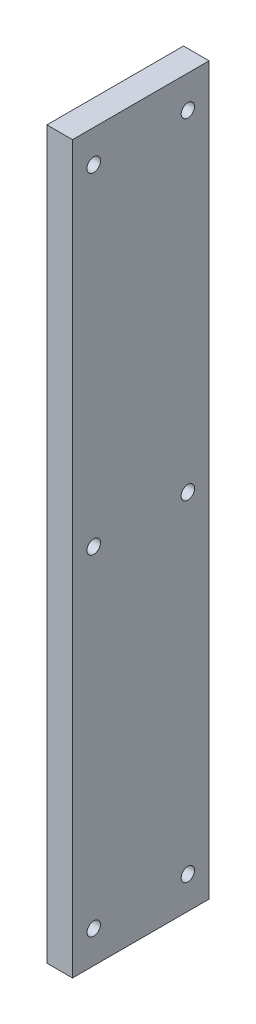
ISO-10303-21;
HEADER;
FILE_DESCRIPTION(('STEP AP214'),'2;1');
FILE_NAME('part.step','',(''),(''),'','','');
FILE_SCHEMA(('AUTOMOTIVE_DESIGN { 1 0 10303 214 1 1 1 1 }'));
ENDSEC;
DATA;
#1=APPLICATION_CONTEXT('core data for automotive mechanical design processes');
#2=APPLICATION_PROTOCOL_DEFINITION('international standard','automotive_design',2000,#1);
#3=PRODUCT_CONTEXT('',#1,'mechanical');
#4=PRODUCT('Part','Part','',(#3));
#5=PRODUCT_RELATED_PRODUCT_CATEGORY('part','',(#4));
#6=PRODUCT_DEFINITION_FORMATION('','',#4);
#7=PRODUCT_DEFINITION_CONTEXT('part definition',#1,'design');
#8=PRODUCT_DEFINITION('design','',#6,#7);
#9=PRODUCT_DEFINITION_SHAPE('','',#8);
#10=(LENGTH_UNIT() NAMED_UNIT(*) SI_UNIT(.MILLI.,.METRE.));
#11=(NAMED_UNIT(*) PLANE_ANGLE_UNIT() SI_UNIT($,.RADIAN.));
#12=(NAMED_UNIT(*) SI_UNIT($,.STERADIAN.) SOLID_ANGLE_UNIT());
#13=UNCERTAINTY_MEASURE_WITH_UNIT(LENGTH_MEASURE(1.E-05),#10,'distance_accuracy_value','');
#14=(GEOMETRIC_REPRESENTATION_CONTEXT(3) GLOBAL_UNCERTAINTY_ASSIGNED_CONTEXT((#13)) GLOBAL_UNIT_ASSIGNED_CONTEXT((#10,
#11,#12)) REPRESENTATION_CONTEXT('',''));
#15=CARTESIAN_POINT('',(0.,0.,0.));
#16=DIRECTION('',(0.,0.,1.));
#17=DIRECTION('',(1.,0.,0.));
#18=AXIS2_PLACEMENT_3D('',#15,#16,#17);
#19=CARTESIAN_POINT('',(9.525,-135.,25.4));
#20=DIRECTION('',(0.,0.,-1.));
#21=DIRECTION('',(0.,1.,0.));
#22=AXIS2_PLACEMENT_3D('',#19,#20,#21);
#23=PLANE('',#22);
#24=DIRECTION('',(0.,-1.,0.));
#25=VECTOR('',#24,1.);
#26=CARTESIAN_POINT('',(0.,-135.,25.4));
#27=LINE('',#26,#25);
#28=CARTESIAN_POINT('',(0.,135.,25.4));
#29=VERTEX_POINT('',#28);
#30=CARTESIAN_POINT('',(0.,-135.,25.4));
#31=VERTEX_POINT('',#30);
#32=EDGE_CURVE('E96',#29,#31,#27,.T.);
#33=ORIENTED_EDGE('',*,*,#32,.T.);
#34=DIRECTION('',(-1.,0.,0.));
#35=VECTOR('',#34,1.);
#36=CARTESIAN_POINT('',(9.525,-135.,25.4));
#37=LINE('',#36,#35);
#38=CARTESIAN_POINT('',(9.525,-135.,25.4));
#39=VERTEX_POINT('',#38);
#40=EDGE_CURVE('E11',#39,#31,#37,.T.);
#41=ORIENTED_EDGE('',*,*,#40,.F.);
#42=DIRECTION('',(0.,-1.,0.));
#43=VECTOR('',#42,1.);
#44=CARTESIAN_POINT('',(9.525,-135.,25.4));
#45=LINE('',#44,#43);
#46=CARTESIAN_POINT('',(9.525,135.,25.4));
#47=VERTEX_POINT('',#46);
#48=EDGE_CURVE('E84',#47,#39,#45,.T.);
#49=ORIENTED_EDGE('',*,*,#48,.F.);
#50=DIRECTION('',(-1.,0.,0.));
#51=VECTOR('',#50,1.);
#52=CARTESIAN_POINT('',(9.525,135.,25.4));
#53=LINE('',#52,#51);
#54=EDGE_CURVE('E92',#47,#29,#53,.T.);
#55=ORIENTED_EDGE('',*,*,#54,.T.);
#56=EDGE_LOOP('',(#33,#41,#49,#55));
#57=FACE_BOUND('',#56,.T.);
#58=ADVANCED_FACE('F33',(#57),#23,.F.);
#59=CARTESIAN_POINT('',(9.525,-135.,-25.4));
#60=DIRECTION('',(0.,1.,0.));
#61=DIRECTION('',(0.,0.,1.));
#62=AXIS2_PLACEMENT_3D('',#59,#60,#61);
#63=PLANE('',#62);
#64=DIRECTION('',(0.,0.,-1.));
#65=VECTOR('',#64,1.);
#66=CARTESIAN_POINT('',(0.,-135.,-25.4));
#67=LINE('',#66,#65);
#68=CARTESIAN_POINT('',(0.,-135.,-25.4));
#69=VERTEX_POINT('',#68);
#70=EDGE_CURVE('E88',#31,#69,#67,.T.);
#71=ORIENTED_EDGE('',*,*,#70,.T.);
#72=DIRECTION('',(-1.,0.,0.));
#73=VECTOR('',#72,1.);
#74=CARTESIAN_POINT('',(9.525,-135.,-25.4));
#75=LINE('',#74,#73);
#76=CARTESIAN_POINT('',(9.525,-135.,-25.4));
#77=VERTEX_POINT('',#76);
#78=EDGE_CURVE('E41',#77,#69,#75,.T.);
#79=ORIENTED_EDGE('',*,*,#78,.F.);
#80=DIRECTION('',(0.,0.,-1.));
#81=VECTOR('',#80,1.);
#82=CARTESIAN_POINT('',(9.525,-135.,-25.4));
#83=LINE('',#82,#81);
#84=EDGE_CURVE('E79',#39,#77,#83,.T.);
#85=ORIENTED_EDGE('',*,*,#84,.F.);
#86=ORIENTED_EDGE('',*,*,#40,.T.);
#87=EDGE_LOOP('',(#71,#79,#85,#86));
#88=FACE_BOUND('',#87,.T.);
#89=ADVANCED_FACE('F87',(#88),#63,.F.);
#90=CARTESIAN_POINT('',(9.525,-135.,-25.4));
#91=DIRECTION('',(0.,0.,1.));
#92=DIRECTION('',(1.,0.,0.));
#93=AXIS2_PLACEMENT_3D('',#90,#91,#92);
#94=PLANE('',#93);
#95=DIRECTION('',(0.,1.,0.));
#96=VECTOR('',#95,1.);
#97=CARTESIAN_POINT('',(0.,-135.,-25.4));
#98=LINE('',#97,#96);
#99=CARTESIAN_POINT('',(0.,135.,-25.4));
#100=VERTEX_POINT('',#99);
#101=EDGE_CURVE('E66',#69,#100,#98,.T.);
#102=ORIENTED_EDGE('',*,*,#101,.T.);
#103=DIRECTION('',(-1.,0.,0.));
#104=VECTOR('',#103,1.);
#105=CARTESIAN_POINT('',(9.525,135.,-25.4));
#106=LINE('',#105,#104);
#107=CARTESIAN_POINT('',(9.525,135.,-25.4));
#108=VERTEX_POINT('',#107);
#109=EDGE_CURVE('E89',#108,#100,#106,.T.);
#110=ORIENTED_EDGE('',*,*,#109,.F.);
#111=DIRECTION('',(0.,1.,0.));
#112=VECTOR('',#111,1.);
#113=CARTESIAN_POINT('',(9.525,-135.,-25.4));
#114=LINE('',#113,#112);
#115=EDGE_CURVE('E82',#77,#108,#114,.T.);
#116=ORIENTED_EDGE('',*,*,#115,.F.);
#117=ORIENTED_EDGE('',*,*,#78,.T.);
#118=EDGE_LOOP('',(#102,#110,#116,#117));
#119=FACE_BOUND('',#118,.T.);
#120=ADVANCED_FACE('F90',(#119),#94,.F.);
#121=CARTESIAN_POINT('',(9.525,135.,-25.4));
#122=DIRECTION('',(0.,-1.,0.));
#123=DIRECTION('',(0.,0.,-1.));
#124=AXIS2_PLACEMENT_3D('',#121,#122,#123);
#125=PLANE('',#124);
#126=DIRECTION('',(0.,0.,1.));
#127=VECTOR('',#126,1.);
#128=CARTESIAN_POINT('',(0.,135.,-25.4));
#129=LINE('',#128,#127);
#130=EDGE_CURVE('E72',#100,#29,#129,.T.);
#131=ORIENTED_EDGE('',*,*,#130,.T.);
#132=ORIENTED_EDGE('',*,*,#54,.F.);
#133=DIRECTION('',(0.,0.,1.));
#134=VECTOR('',#133,1.);
#135=CARTESIAN_POINT('',(9.525,135.,-25.4));
#136=LINE('',#135,#134);
#137=EDGE_CURVE('E49',#108,#47,#136,.T.);
#138=ORIENTED_EDGE('',*,*,#137,.F.);
#139=ORIENTED_EDGE('',*,*,#109,.T.);
#140=EDGE_LOOP('',(#131,#132,#138,#139));
#141=FACE_BOUND('',#140,.T.);
#142=ADVANCED_FACE('F104',(#141),#125,.F.);
#143=CARTESIAN_POINT('',(9.525,0.,0.));
#144=DIRECTION('',(1.,0.,0.));
#145=DIRECTION('',(0.,0.,-1.));
#146=AXIS2_PLACEMENT_3D('',#143,#144,#145);
#147=PLANE('',#146);
#148=CARTESIAN_POINT('',(9.525,0.,-17.5));
#149=DIRECTION('',(1.,0.,0.));
#150=DIRECTION('',(0.,0.,-1.));
#151=AXIS2_PLACEMENT_3D('',#148,#149,#150);
#152=CIRCLE('',#151,2.50801824007187);
#153=CARTESIAN_POINT('',(9.525,0.,-20.0080182400719));
#154=VERTEX_POINT('',#153);
#155=EDGE_CURVE('E128',#154,#154,#152,.T.);
#156=ORIENTED_EDGE('',*,*,#155,.F.);
#157=EDGE_LOOP('',(#156));
#158=FACE_BOUND('',#157,.T.);
#159=CARTESIAN_POINT('',(9.525,0.,17.5));
#160=DIRECTION('',(1.,0.,0.));
#161=DIRECTION('',(0.,0.,-1.));
#162=AXIS2_PLACEMENT_3D('',#159,#160,#161);
#163=CIRCLE('',#162,2.51510559759041);
#164=CARTESIAN_POINT('',(9.525,0.,14.9848944024096));
#165=VERTEX_POINT('',#164);
#166=EDGE_CURVE('E134',#165,#165,#163,.T.);
#167=ORIENTED_EDGE('',*,*,#166,.F.);
#168=EDGE_LOOP('',(#167));
#169=FACE_BOUND('',#168,.T.);
#170=CARTESIAN_POINT('',(9.525,123.,17.5));
#171=DIRECTION('',(1.,0.,0.));
#172=DIRECTION('',(0.,0.,-1.));
#173=AXIS2_PLACEMENT_3D('',#170,#171,#172);
#174=CIRCLE('',#173,2.53355567132593);
#175=CARTESIAN_POINT('',(9.525,123.,14.9664443286741));
#176=VERTEX_POINT('',#175);
#177=EDGE_CURVE('E140',#176,#176,#174,.T.);
#178=ORIENTED_EDGE('',*,*,#177,.F.);
#179=EDGE_LOOP('',(#178));
#180=FACE_BOUND('',#179,.T.);
#181=CARTESIAN_POINT('',(9.525,123.,-17.5));
#182=DIRECTION('',(1.,0.,0.));
#183=DIRECTION('',(0.,0.,-1.));
#184=AXIS2_PLACEMENT_3D('',#181,#182,#183);
#185=CIRCLE('',#184,2.48081684329031);
#186=CARTESIAN_POINT('',(9.525,123.,-19.9808168432903));
#187=VERTEX_POINT('',#186);
#188=EDGE_CURVE('E116',#187,#187,#185,.T.);
#189=ORIENTED_EDGE('',*,*,#188,.F.);
#190=EDGE_LOOP('',(#189));
#191=FACE_BOUND('',#190,.T.);
#192=CARTESIAN_POINT('',(9.525,-123.,-17.5));
#193=DIRECTION('',(1.,0.,0.));
#194=DIRECTION('',(0.,0.,-1.));
#195=AXIS2_PLACEMENT_3D('',#192,#193,#194);
#196=CIRCLE('',#195,2.48624336836679);
#197=CARTESIAN_POINT('',(9.525,-123.,-19.9862433683668));
#198=VERTEX_POINT('',#197);
#199=EDGE_CURVE('E123',#198,#198,#196,.T.);
#200=ORIENTED_EDGE('',*,*,#199,.F.);
#201=EDGE_LOOP('',(#200));
#202=FACE_BOUND('',#201,.T.);
#203=CARTESIAN_POINT('',(9.525,-123.,17.5));
#204=DIRECTION('',(1.,0.,0.));
#205=DIRECTION('',(0.,0.,-1.));
#206=AXIS2_PLACEMENT_3D('',#203,#204,#205);
#207=CIRCLE('',#206,2.48487197635141);
#208=CARTESIAN_POINT('',(9.525,-123.,15.0151280236486));
#209=VERTEX_POINT('',#208);
#210=EDGE_CURVE('E110',#209,#209,#207,.T.);
#211=ORIENTED_EDGE('',*,*,#210,.F.);
#212=EDGE_LOOP('',(#211));
#213=FACE_BOUND('',#212,.T.);
#214=ORIENTED_EDGE('',*,*,#48,.T.);
#215=ORIENTED_EDGE('',*,*,#84,.T.);
#216=ORIENTED_EDGE('',*,*,#115,.T.);
#217=ORIENTED_EDGE('',*,*,#137,.T.);
#218=EDGE_LOOP('',(#214,#215,#216,#217));
#219=FACE_BOUND('',#218,.T.);
#220=ADVANCED_FACE('F80',(#158,#169,#180,#191,#202,#213,#219),#147,.T.);
#221=CARTESIAN_POINT('',(0.,0.,0.));
#222=DIRECTION('',(1.,0.,0.));
#223=DIRECTION('',(0.,0.,-1.));
#224=AXIS2_PLACEMENT_3D('',#221,#222,#223);
#225=PLANE('',#224);
#226=CARTESIAN_POINT('',(0.,0.,-17.5));
#227=DIRECTION('',(1.,0.,0.));
#228=DIRECTION('',(0.,0.,-1.));
#229=AXIS2_PLACEMENT_3D('',#226,#227,#228);
#230=CIRCLE('',#229,2.50801824007187);
#231=CARTESIAN_POINT('',(0.,0.,-20.0080182400719));
#232=VERTEX_POINT('',#231);
#233=EDGE_CURVE('E131',#232,#232,#230,.T.);
#234=ORIENTED_EDGE('',*,*,#233,.T.);
#235=EDGE_LOOP('',(#234));
#236=FACE_BOUND('',#235,.T.);
#237=CARTESIAN_POINT('',(0.,0.,17.5));
#238=DIRECTION('',(1.,0.,0.));
#239=DIRECTION('',(0.,0.,-1.));
#240=AXIS2_PLACEMENT_3D('',#237,#238,#239);
#241=CIRCLE('',#240,2.51510559759041);
#242=CARTESIAN_POINT('',(0.,0.,14.9848944024096));
#243=VERTEX_POINT('',#242);
#244=EDGE_CURVE('E137',#243,#243,#241,.T.);
#245=ORIENTED_EDGE('',*,*,#244,.T.);
#246=EDGE_LOOP('',(#245));
#247=FACE_BOUND('',#246,.T.);
#248=CARTESIAN_POINT('',(0.,123.,17.5));
#249=DIRECTION('',(1.,0.,0.));
#250=DIRECTION('',(0.,0.,-1.));
#251=AXIS2_PLACEMENT_3D('',#248,#249,#250);
#252=CIRCLE('',#251,2.53355567132593);
#253=CARTESIAN_POINT('',(0.,123.,14.9664443286741));
#254=VERTEX_POINT('',#253);
#255=EDGE_CURVE('E120',#254,#254,#252,.T.);
#256=ORIENTED_EDGE('',*,*,#255,.T.);
#257=EDGE_LOOP('',(#256));
#258=FACE_BOUND('',#257,.T.);
#259=CARTESIAN_POINT('',(0.,123.,-17.5));
#260=DIRECTION('',(1.,0.,0.));
#261=DIRECTION('',(0.,0.,-1.));
#262=AXIS2_PLACEMENT_3D('',#259,#260,#261);
#263=CIRCLE('',#262,2.48081684329031);
#264=CARTESIAN_POINT('',(0.,123.,-19.9808168432903));
#265=VERTEX_POINT('',#264);
#266=EDGE_CURVE('E119',#265,#265,#263,.T.);
#267=ORIENTED_EDGE('',*,*,#266,.T.);
#268=EDGE_LOOP('',(#267));
#269=FACE_BOUND('',#268,.T.);
#270=CARTESIAN_POINT('',(0.,-123.,-17.5));
#271=DIRECTION('',(1.,0.,0.));
#272=DIRECTION('',(0.,0.,-1.));
#273=AXIS2_PLACEMENT_3D('',#270,#271,#272);
#274=CIRCLE('',#273,2.48624336836679);
#275=CARTESIAN_POINT('',(0.,-123.,-19.9862433683668));
#276=VERTEX_POINT('',#275);
#277=EDGE_CURVE('E113',#276,#276,#274,.T.);
#278=ORIENTED_EDGE('',*,*,#277,.T.);
#279=EDGE_LOOP('',(#278));
#280=FACE_BOUND('',#279,.T.);
#281=CARTESIAN_POINT('',(0.,-123.,17.5));
#282=DIRECTION('',(1.,0.,0.));
#283=DIRECTION('',(0.,0.,-1.));
#284=AXIS2_PLACEMENT_3D('',#281,#282,#283);
#285=CIRCLE('',#284,2.48487197635141);
#286=CARTESIAN_POINT('',(0.,-123.,15.0151280236486));
#287=VERTEX_POINT('',#286);
#288=EDGE_CURVE('E99',#287,#287,#285,.T.);
#289=ORIENTED_EDGE('',*,*,#288,.T.);
#290=EDGE_LOOP('',(#289));
#291=FACE_BOUND('',#290,.T.);
#292=ORIENTED_EDGE('',*,*,#32,.F.);
#293=ORIENTED_EDGE('',*,*,#130,.F.);
#294=ORIENTED_EDGE('',*,*,#101,.F.);
#295=ORIENTED_EDGE('',*,*,#70,.F.);
#296=EDGE_LOOP('',(#292,#293,#294,#295));
#297=FACE_BOUND('',#296,.T.);
#298=ADVANCED_FACE('F107',(#236,#247,#258,#269,#280,#291,#297),#225,.F.);
#299=CARTESIAN_POINT('',(0.,-123.,17.5));
#300=DIRECTION('',(1.,0.,0.));
#301=DIRECTION('',(0.,0.,-1.));
#302=AXIS2_PLACEMENT_3D('',#299,#300,#301);
#303=CYLINDRICAL_SURFACE('',#302,2.48487197635141);
#304=CARTESIAN_POINT('',(0.,-123.,15.0151280236486));
#305=CARTESIAN_POINT('',(0.0992187499999999,-123.,15.0151280236486));
#306=CARTESIAN_POINT('',(0.1984375,-123.,15.0151280236486));
#307=CARTESIAN_POINT('',(0.396875,-123.,15.0151280236486));
#308=CARTESIAN_POINT('',(0.49609375,-123.,15.0151280236486));
#309=CARTESIAN_POINT('',(0.69453125,-123.,15.0151280236486));
#310=CARTESIAN_POINT('',(0.79375,-123.,15.0151280236486));
#311=CARTESIAN_POINT('',(0.9921875,-123.,15.0151280236486));
#312=CARTESIAN_POINT('',(1.09140625,-123.,15.0151280236486));
#313=CARTESIAN_POINT('',(1.28984375,-123.,15.0151280236486));
#314=CARTESIAN_POINT('',(1.3890625,-123.,15.0151280236486));
#315=CARTESIAN_POINT('',(1.5875,-123.,15.0151280236486));
#316=CARTESIAN_POINT('',(1.68671875,-123.,15.0151280236486));
#317=CARTESIAN_POINT('',(1.88515625,-123.,15.0151280236486));
#318=CARTESIAN_POINT('',(1.984375,-123.,15.0151280236486));
#319=CARTESIAN_POINT('',(2.1828125,-123.,15.0151280236486));
#320=CARTESIAN_POINT('',(2.28203125,-123.,15.0151280236486));
#321=CARTESIAN_POINT('',(2.48046875,-123.,15.0151280236486));
#322=CARTESIAN_POINT('',(2.5796875,-123.,15.0151280236486));
#323=CARTESIAN_POINT('',(2.778125,-123.,15.0151280236486));
#324=CARTESIAN_POINT('',(2.87734375,-123.,15.0151280236486));
#325=CARTESIAN_POINT('',(3.07578125,-123.,15.0151280236486));
#326=CARTESIAN_POINT('',(3.175,-123.,15.0151280236486));
#327=CARTESIAN_POINT('',(3.3734375,-123.,15.0151280236486));
#328=CARTESIAN_POINT('',(3.47265625,-123.,15.0151280236486));
#329=CARTESIAN_POINT('',(3.67109375,-123.,15.0151280236486));
#330=CARTESIAN_POINT('',(3.7703125,-123.,15.0151280236486));
#331=CARTESIAN_POINT('',(3.96875,-123.,15.0151280236486));
#332=CARTESIAN_POINT('',(4.06796875,-123.,15.0151280236486));
#333=CARTESIAN_POINT('',(4.26640625,-123.,15.0151280236486));
#334=CARTESIAN_POINT('',(4.365625,-123.,15.0151280236486));
#335=CARTESIAN_POINT('',(4.5640625,-123.,15.0151280236486));
#336=CARTESIAN_POINT('',(4.66328125,-123.,15.0151280236486));
#337=CARTESIAN_POINT('',(4.86171875,-123.,15.0151280236486));
#338=CARTESIAN_POINT('',(4.9609375,-123.,15.0151280236486));
#339=CARTESIAN_POINT('',(5.159375,-123.,15.0151280236486));
#340=CARTESIAN_POINT('',(5.25859375,-123.,15.0151280236486));
#341=CARTESIAN_POINT('',(5.45703125,-123.,15.0151280236486));
#342=CARTESIAN_POINT('',(5.55625,-123.,15.0151280236486));
#343=CARTESIAN_POINT('',(5.7546875,-123.,15.0151280236486));
#344=CARTESIAN_POINT('',(5.85390625,-123.,15.0151280236486));
#345=CARTESIAN_POINT('',(6.05234375,-123.,15.0151280236486));
#346=CARTESIAN_POINT('',(6.1515625,-123.,15.0151280236486));
#347=CARTESIAN_POINT('',(6.35,-123.,15.0151280236486));
#348=CARTESIAN_POINT('',(6.44921875,-123.,15.0151280236486));
#349=CARTESIAN_POINT('',(6.64765625,-123.,15.0151280236486));
#350=CARTESIAN_POINT('',(6.746875,-123.,15.0151280236486));
#351=CARTESIAN_POINT('',(6.9453125,-123.,15.0151280236486));
#352=CARTESIAN_POINT('',(7.04453125,-123.,15.0151280236486));
#353=CARTESIAN_POINT('',(7.24296875,-123.,15.0151280236486));
#354=CARTESIAN_POINT('',(7.3421875,-123.,15.0151280236486));
#355=CARTESIAN_POINT('',(7.540625,-123.,15.0151280236486));
#356=CARTESIAN_POINT('',(7.63984375,-123.,15.0151280236486));
#357=CARTESIAN_POINT('',(7.83828125,-123.,15.0151280236486));
#358=CARTESIAN_POINT('',(7.9375,-123.,15.0151280236486));
#359=CARTESIAN_POINT('',(8.1359375,-123.,15.0151280236486));
#360=CARTESIAN_POINT('',(8.23515625,-123.,15.0151280236486));
#361=CARTESIAN_POINT('',(8.43359375,-123.,15.0151280236486));
#362=CARTESIAN_POINT('',(8.5328125,-123.,15.0151280236486));
#363=CARTESIAN_POINT('',(8.73125,-123.,15.0151280236486));
#364=CARTESIAN_POINT('',(8.83046875,-123.,15.0151280236486));
#365=CARTESIAN_POINT('',(9.02890625,-123.,15.0151280236486));
#366=CARTESIAN_POINT('',(9.128125,-123.,15.0151280236486));
#367=CARTESIAN_POINT('',(9.3265625,-123.,15.0151280236486));
#368=CARTESIAN_POINT('',(9.42578125,-123.,15.0151280236486));
#369=CARTESIAN_POINT('',(9.525,-123.,15.0151280236486));
#370=B_SPLINE_CURVE_WITH_KNOTS('',3,(#304,#305,#306,#307,#308,#309,#310,#311,#312,#313,#314,
#315,#316,#317,#318,#319,#320,#321,#322,#323,#324,#325,#326,#327,#328,#329,#330,#331,#332,#333,
#334,#335,#336,#337,#338,#339,#340,#341,#342,#343,#344,#345,#346,#347,#348,#349,#350,#351,#352,
#353,#354,#355,#356,#357,#358,#359,#360,#361,#362,#363,#364,#365,#366,#367,#368,#369),
.UNSPECIFIED.,.F.,.F.,(4,2,2,2,2,2,2,2,2,2,2,2,2,2,2,2,2,2,2,2,2,2,2,2,2,2,2,2,2,2,2,2,4),(0.,
0.29765625,0.5953125,0.89296875,1.190625,1.48828125,1.7859375,2.08359375,2.38125,2.67890625,
2.9765625,3.27421875,3.571875,3.86953125,4.1671875,4.46484375,4.7625,5.06015625,5.3578125,
5.65546875,5.953125,6.25078125,6.5484375,6.84609375,7.14375,7.44140625,7.7390625,8.03671875,
8.334375,8.63203125,8.9296875,9.22734375,9.525),.UNSPECIFIED.);
#371=EDGE_CURVE('BSEAM166',#287,#209,#370,.T.);
#372=ORIENTED_EDGE('',*,*,#288,.F.);
#373=ORIENTED_EDGE('',*,*,#210,.T.);
#374=ORIENTED_EDGE('',*,*,#371,.T.);
#375=ORIENTED_EDGE('',*,*,#371,.F.);
#376=EDGE_LOOP('',(#372,#374,#373,#375));
#377=FACE_BOUND('',#376,.T.);
#378=ADVANCED_FACE('F166',(#377),#303,.F.);
#379=CARTESIAN_POINT('',(0.,-123.,-17.5));
#380=DIRECTION('',(1.,0.,0.));
#381=DIRECTION('',(0.,0.,-1.));
#382=AXIS2_PLACEMENT_3D('',#379,#380,#381);
#383=CYLINDRICAL_SURFACE('',#382,2.48624336836679);
#384=CARTESIAN_POINT('',(0.,-123.,-19.9862433683668));
#385=CARTESIAN_POINT('',(0.0992187499999999,-123.,-19.9862433683668));
#386=CARTESIAN_POINT('',(0.1984375,-123.,-19.9862433683668));
#387=CARTESIAN_POINT('',(0.396875,-123.,-19.9862433683668));
#388=CARTESIAN_POINT('',(0.49609375,-123.,-19.9862433683668));
#389=CARTESIAN_POINT('',(0.69453125,-123.,-19.9862433683668));
#390=CARTESIAN_POINT('',(0.79375,-123.,-19.9862433683668));
#391=CARTESIAN_POINT('',(0.9921875,-123.,-19.9862433683668));
#392=CARTESIAN_POINT('',(1.09140625,-123.,-19.9862433683668));
#393=CARTESIAN_POINT('',(1.28984375,-123.,-19.9862433683668));
#394=CARTESIAN_POINT('',(1.3890625,-123.,-19.9862433683668));
#395=CARTESIAN_POINT('',(1.5875,-123.,-19.9862433683668));
#396=CARTESIAN_POINT('',(1.68671875,-123.,-19.9862433683668));
#397=CARTESIAN_POINT('',(1.88515625,-123.,-19.9862433683668));
#398=CARTESIAN_POINT('',(1.984375,-123.,-19.9862433683668));
#399=CARTESIAN_POINT('',(2.1828125,-123.,-19.9862433683668));
#400=CARTESIAN_POINT('',(2.28203125,-123.,-19.9862433683668));
#401=CARTESIAN_POINT('',(2.48046875,-123.,-19.9862433683668));
#402=CARTESIAN_POINT('',(2.5796875,-123.,-19.9862433683668));
#403=CARTESIAN_POINT('',(2.778125,-123.,-19.9862433683668));
#404=CARTESIAN_POINT('',(2.87734375,-123.,-19.9862433683668));
#405=CARTESIAN_POINT('',(3.07578125,-123.,-19.9862433683668));
#406=CARTESIAN_POINT('',(3.175,-123.,-19.9862433683668));
#407=CARTESIAN_POINT('',(3.3734375,-123.,-19.9862433683668));
#408=CARTESIAN_POINT('',(3.47265625,-123.,-19.9862433683668));
#409=CARTESIAN_POINT('',(3.67109375,-123.,-19.9862433683668));
#410=CARTESIAN_POINT('',(3.7703125,-123.,-19.9862433683668));
#411=CARTESIAN_POINT('',(3.96875,-123.,-19.9862433683668));
#412=CARTESIAN_POINT('',(4.06796875,-123.,-19.9862433683668));
#413=CARTESIAN_POINT('',(4.26640625,-123.,-19.9862433683668));
#414=CARTESIAN_POINT('',(4.365625,-123.,-19.9862433683668));
#415=CARTESIAN_POINT('',(4.5640625,-123.,-19.9862433683668));
#416=CARTESIAN_POINT('',(4.66328125,-123.,-19.9862433683668));
#417=CARTESIAN_POINT('',(4.86171875,-123.,-19.9862433683668));
#418=CARTESIAN_POINT('',(4.9609375,-123.,-19.9862433683668));
#419=CARTESIAN_POINT('',(5.159375,-123.,-19.9862433683668));
#420=CARTESIAN_POINT('',(5.25859375,-123.,-19.9862433683668));
#421=CARTESIAN_POINT('',(5.45703125,-123.,-19.9862433683668));
#422=CARTESIAN_POINT('',(5.55625,-123.,-19.9862433683668));
#423=CARTESIAN_POINT('',(5.7546875,-123.,-19.9862433683668));
#424=CARTESIAN_POINT('',(5.85390625,-123.,-19.9862433683668));
#425=CARTESIAN_POINT('',(6.05234375,-123.,-19.9862433683668));
#426=CARTESIAN_POINT('',(6.1515625,-123.,-19.9862433683668));
#427=CARTESIAN_POINT('',(6.35,-123.,-19.9862433683668));
#428=CARTESIAN_POINT('',(6.44921875,-123.,-19.9862433683668));
#429=CARTESIAN_POINT('',(6.64765625,-123.,-19.9862433683668));
#430=CARTESIAN_POINT('',(6.746875,-123.,-19.9862433683668));
#431=CARTESIAN_POINT('',(6.9453125,-123.,-19.9862433683668));
#432=CARTESIAN_POINT('',(7.04453125,-123.,-19.9862433683668));
#433=CARTESIAN_POINT('',(7.24296875,-123.,-19.9862433683668));
#434=CARTESIAN_POINT('',(7.3421875,-123.,-19.9862433683668));
#435=CARTESIAN_POINT('',(7.540625,-123.,-19.9862433683668));
#436=CARTESIAN_POINT('',(7.63984375,-123.,-19.9862433683668));
#437=CARTESIAN_POINT('',(7.83828125,-123.,-19.9862433683668));
#438=CARTESIAN_POINT('',(7.9375,-123.,-19.9862433683668));
#439=CARTESIAN_POINT('',(8.1359375,-123.,-19.9862433683668));
#440=CARTESIAN_POINT('',(8.23515625,-123.,-19.9862433683668));
#441=CARTESIAN_POINT('',(8.43359375,-123.,-19.9862433683668));
#442=CARTESIAN_POINT('',(8.5328125,-123.,-19.9862433683668));
#443=CARTESIAN_POINT('',(8.73125,-123.,-19.9862433683668));
#444=CARTESIAN_POINT('',(8.83046875,-123.,-19.9862433683668));
#445=CARTESIAN_POINT('',(9.02890625,-123.,-19.9862433683668));
#446=CARTESIAN_POINT('',(9.128125,-123.,-19.9862433683668));
#447=CARTESIAN_POINT('',(9.3265625,-123.,-19.9862433683668));
#448=CARTESIAN_POINT('',(9.42578125,-123.,-19.9862433683668));
#449=CARTESIAN_POINT('',(9.525,-123.,-19.9862433683668));
#450=B_SPLINE_CURVE_WITH_KNOTS('',3,(#384,#385,#386,#387,#388,#389,#390,#391,#392,#393,#394,
#395,#396,#397,#398,#399,#400,#401,#402,#403,#404,#405,#406,#407,#408,#409,#410,#411,#412,#413,
#414,#415,#416,#417,#418,#419,#420,#421,#422,#423,#424,#425,#426,#427,#428,#429,#430,#431,#432,
#433,#434,#435,#436,#437,#438,#439,#440,#441,#442,#443,#444,#445,#446,#447,#448,#449),
.UNSPECIFIED.,.F.,.F.,(4,2,2,2,2,2,2,2,2,2,2,2,2,2,2,2,2,2,2,2,2,2,2,2,2,2,2,2,2,2,2,2,4),(0.,
0.29765625,0.5953125,0.89296875,1.190625,1.48828125,1.7859375,2.08359375,2.38125,2.67890625,
2.9765625,3.27421875,3.571875,3.86953125,4.1671875,4.46484375,4.7625,5.06015625,5.3578125,
5.65546875,5.953125,6.25078125,6.5484375,6.84609375,7.14375,7.44140625,7.7390625,8.03671875,
8.334375,8.63203125,8.9296875,9.22734375,9.525),.UNSPECIFIED.);
#451=EDGE_CURVE('BSEAM168',#276,#198,#450,.T.);
#452=ORIENTED_EDGE('',*,*,#277,.F.);
#453=ORIENTED_EDGE('',*,*,#199,.T.);
#454=ORIENTED_EDGE('',*,*,#451,.T.);
#455=ORIENTED_EDGE('',*,*,#451,.F.);
#456=EDGE_LOOP('',(#452,#454,#453,#455));
#457=FACE_BOUND('',#456,.T.);
#458=ADVANCED_FACE('F168',(#457),#383,.F.);
#459=CARTESIAN_POINT('',(0.,123.,-17.5));
#460=DIRECTION('',(1.,0.,0.));
#461=DIRECTION('',(0.,0.,-1.));
#462=AXIS2_PLACEMENT_3D('',#459,#460,#461);
#463=CYLINDRICAL_SURFACE('',#462,2.48081684329031);
#464=CARTESIAN_POINT('',(0.,123.,-19.9808168432903));
#465=CARTESIAN_POINT('',(0.0992187499999999,123.,-19.9808168432903));
#466=CARTESIAN_POINT('',(0.1984375,123.,-19.9808168432903));
#467=CARTESIAN_POINT('',(0.396875,123.,-19.9808168432903));
#468=CARTESIAN_POINT('',(0.49609375,123.,-19.9808168432903));
#469=CARTESIAN_POINT('',(0.69453125,123.,-19.9808168432903));
#470=CARTESIAN_POINT('',(0.79375,123.,-19.9808168432903));
#471=CARTESIAN_POINT('',(0.9921875,123.,-19.9808168432903));
#472=CARTESIAN_POINT('',(1.09140625,123.,-19.9808168432903));
#473=CARTESIAN_POINT('',(1.28984375,123.,-19.9808168432903));
#474=CARTESIAN_POINT('',(1.3890625,123.,-19.9808168432903));
#475=CARTESIAN_POINT('',(1.5875,123.,-19.9808168432903));
#476=CARTESIAN_POINT('',(1.68671875,123.,-19.9808168432903));
#477=CARTESIAN_POINT('',(1.88515625,123.,-19.9808168432903));
#478=CARTESIAN_POINT('',(1.984375,123.,-19.9808168432903));
#479=CARTESIAN_POINT('',(2.1828125,123.,-19.9808168432903));
#480=CARTESIAN_POINT('',(2.28203125,123.,-19.9808168432903));
#481=CARTESIAN_POINT('',(2.48046875,123.,-19.9808168432903));
#482=CARTESIAN_POINT('',(2.5796875,123.,-19.9808168432903));
#483=CARTESIAN_POINT('',(2.778125,123.,-19.9808168432903));
#484=CARTESIAN_POINT('',(2.87734375,123.,-19.9808168432903));
#485=CARTESIAN_POINT('',(3.07578125,123.,-19.9808168432903));
#486=CARTESIAN_POINT('',(3.175,123.,-19.9808168432903));
#487=CARTESIAN_POINT('',(3.3734375,123.,-19.9808168432903));
#488=CARTESIAN_POINT('',(3.47265625,123.,-19.9808168432903));
#489=CARTESIAN_POINT('',(3.67109375,123.,-19.9808168432903));
#490=CARTESIAN_POINT('',(3.7703125,123.,-19.9808168432903));
#491=CARTESIAN_POINT('',(3.96875,123.,-19.9808168432903));
#492=CARTESIAN_POINT('',(4.06796875,123.,-19.9808168432903));
#493=CARTESIAN_POINT('',(4.26640625,123.,-19.9808168432903));
#494=CARTESIAN_POINT('',(4.365625,123.,-19.9808168432903));
#495=CARTESIAN_POINT('',(4.5640625,123.,-19.9808168432903));
#496=CARTESIAN_POINT('',(4.66328125,123.,-19.9808168432903));
#497=CARTESIAN_POINT('',(4.86171875,123.,-19.9808168432903));
#498=CARTESIAN_POINT('',(4.9609375,123.,-19.9808168432903));
#499=CARTESIAN_POINT('',(5.159375,123.,-19.9808168432903));
#500=CARTESIAN_POINT('',(5.25859375,123.,-19.9808168432903));
#501=CARTESIAN_POINT('',(5.45703125,123.,-19.9808168432903));
#502=CARTESIAN_POINT('',(5.55625,123.,-19.9808168432903));
#503=CARTESIAN_POINT('',(5.7546875,123.,-19.9808168432903));
#504=CARTESIAN_POINT('',(5.85390625,123.,-19.9808168432903));
#505=CARTESIAN_POINT('',(6.05234375,123.,-19.9808168432903));
#506=CARTESIAN_POINT('',(6.1515625,123.,-19.9808168432903));
#507=CARTESIAN_POINT('',(6.35,123.,-19.9808168432903));
#508=CARTESIAN_POINT('',(6.44921875,123.,-19.9808168432903));
#509=CARTESIAN_POINT('',(6.64765625,123.,-19.9808168432903));
#510=CARTESIAN_POINT('',(6.746875,123.,-19.9808168432903));
#511=CARTESIAN_POINT('',(6.9453125,123.,-19.9808168432903));
#512=CARTESIAN_POINT('',(7.04453125,123.,-19.9808168432903));
#513=CARTESIAN_POINT('',(7.24296875,123.,-19.9808168432903));
#514=CARTESIAN_POINT('',(7.3421875,123.,-19.9808168432903));
#515=CARTESIAN_POINT('',(7.540625,123.,-19.9808168432903));
#516=CARTESIAN_POINT('',(7.63984375,123.,-19.9808168432903));
#517=CARTESIAN_POINT('',(7.83828125,123.,-19.9808168432903));
#518=CARTESIAN_POINT('',(7.9375,123.,-19.9808168432903));
#519=CARTESIAN_POINT('',(8.1359375,123.,-19.9808168432903));
#520=CARTESIAN_POINT('',(8.23515625,123.,-19.9808168432903));
#521=CARTESIAN_POINT('',(8.43359375,123.,-19.9808168432903));
#522=CARTESIAN_POINT('',(8.5328125,123.,-19.9808168432903));
#523=CARTESIAN_POINT('',(8.73125,123.,-19.9808168432903));
#524=CARTESIAN_POINT('',(8.83046875,123.,-19.9808168432903));
#525=CARTESIAN_POINT('',(9.02890625,123.,-19.9808168432903));
#526=CARTESIAN_POINT('',(9.128125,123.,-19.9808168432903));
#527=CARTESIAN_POINT('',(9.3265625,123.,-19.9808168432903));
#528=CARTESIAN_POINT('',(9.42578125,123.,-19.9808168432903));
#529=CARTESIAN_POINT('',(9.525,123.,-19.9808168432903));
#530=B_SPLINE_CURVE_WITH_KNOTS('',3,(#464,#465,#466,#467,#468,#469,#470,#471,#472,#473,#474,
#475,#476,#477,#478,#479,#480,#481,#482,#483,#484,#485,#486,#487,#488,#489,#490,#491,#492,#493,
#494,#495,#496,#497,#498,#499,#500,#501,#502,#503,#504,#505,#506,#507,#508,#509,#510,#511,#512,
#513,#514,#515,#516,#517,#518,#519,#520,#521,#522,#523,#524,#525,#526,#527,#528,#529),
.UNSPECIFIED.,.F.,.F.,(4,2,2,2,2,2,2,2,2,2,2,2,2,2,2,2,2,2,2,2,2,2,2,2,2,2,2,2,2,2,2,2,4),(0.,
0.29765625,0.5953125,0.89296875,1.190625,1.48828125,1.7859375,2.08359375,2.38125,2.67890625,
2.9765625,3.27421875,3.571875,3.86953125,4.1671875,4.46484375,4.7625,5.06015625,5.3578125,
5.65546875,5.953125,6.25078125,6.5484375,6.84609375,7.14375,7.44140625,7.7390625,8.03671875,
8.334375,8.63203125,8.9296875,9.22734375,9.525),.UNSPECIFIED.);
#531=EDGE_CURVE('BSEAM152',#265,#187,#530,.T.);
#532=ORIENTED_EDGE('',*,*,#266,.F.);
#533=ORIENTED_EDGE('',*,*,#188,.T.);
#534=ORIENTED_EDGE('',*,*,#531,.T.);
#535=ORIENTED_EDGE('',*,*,#531,.F.);
#536=EDGE_LOOP('',(#532,#534,#533,#535));
#537=FACE_BOUND('',#536,.T.);
#538=ADVANCED_FACE('F152',(#537),#463,.F.);
#539=CARTESIAN_POINT('',(0.,123.,17.5));
#540=DIRECTION('',(1.,0.,0.));
#541=DIRECTION('',(0.,0.,-1.));
#542=AXIS2_PLACEMENT_3D('',#539,#540,#541);
#543=CYLINDRICAL_SURFACE('',#542,2.53355567132593);
#544=CARTESIAN_POINT('',(0.,123.,14.9664443286741));
#545=CARTESIAN_POINT('',(0.0992187499999999,123.,14.9664443286741));
#546=CARTESIAN_POINT('',(0.1984375,123.,14.9664443286741));
#547=CARTESIAN_POINT('',(0.396875,123.,14.9664443286741));
#548=CARTESIAN_POINT('',(0.49609375,123.,14.9664443286741));
#549=CARTESIAN_POINT('',(0.69453125,123.,14.9664443286741));
#550=CARTESIAN_POINT('',(0.79375,123.,14.9664443286741));
#551=CARTESIAN_POINT('',(0.9921875,123.,14.9664443286741));
#552=CARTESIAN_POINT('',(1.09140625,123.,14.9664443286741));
#553=CARTESIAN_POINT('',(1.28984375,123.,14.9664443286741));
#554=CARTESIAN_POINT('',(1.3890625,123.,14.9664443286741));
#555=CARTESIAN_POINT('',(1.5875,123.,14.9664443286741));
#556=CARTESIAN_POINT('',(1.68671875,123.,14.9664443286741));
#557=CARTESIAN_POINT('',(1.88515625,123.,14.9664443286741));
#558=CARTESIAN_POINT('',(1.984375,123.,14.9664443286741));
#559=CARTESIAN_POINT('',(2.1828125,123.,14.9664443286741));
#560=CARTESIAN_POINT('',(2.28203125,123.,14.9664443286741));
#561=CARTESIAN_POINT('',(2.48046875,123.,14.9664443286741));
#562=CARTESIAN_POINT('',(2.5796875,123.,14.9664443286741));
#563=CARTESIAN_POINT('',(2.778125,123.,14.9664443286741));
#564=CARTESIAN_POINT('',(2.87734375,123.,14.9664443286741));
#565=CARTESIAN_POINT('',(3.07578125,123.,14.9664443286741));
#566=CARTESIAN_POINT('',(3.175,123.,14.9664443286741));
#567=CARTESIAN_POINT('',(3.3734375,123.,14.9664443286741));
#568=CARTESIAN_POINT('',(3.47265625,123.,14.9664443286741));
#569=CARTESIAN_POINT('',(3.67109375,123.,14.9664443286741));
#570=CARTESIAN_POINT('',(3.7703125,123.,14.9664443286741));
#571=CARTESIAN_POINT('',(3.96875,123.,14.9664443286741));
#572=CARTESIAN_POINT('',(4.06796875,123.,14.9664443286741));
#573=CARTESIAN_POINT('',(4.26640625,123.,14.9664443286741));
#574=CARTESIAN_POINT('',(4.365625,123.,14.9664443286741));
#575=CARTESIAN_POINT('',(4.5640625,123.,14.9664443286741));
#576=CARTESIAN_POINT('',(4.66328125,123.,14.9664443286741));
#577=CARTESIAN_POINT('',(4.86171875,123.,14.9664443286741));
#578=CARTESIAN_POINT('',(4.9609375,123.,14.9664443286741));
#579=CARTESIAN_POINT('',(5.159375,123.,14.9664443286741));
#580=CARTESIAN_POINT('',(5.25859375,123.,14.9664443286741));
#581=CARTESIAN_POINT('',(5.45703125,123.,14.9664443286741));
#582=CARTESIAN_POINT('',(5.55625,123.,14.9664443286741));
#583=CARTESIAN_POINT('',(5.7546875,123.,14.9664443286741));
#584=CARTESIAN_POINT('',(5.85390625,123.,14.9664443286741));
#585=CARTESIAN_POINT('',(6.05234375,123.,14.9664443286741));
#586=CARTESIAN_POINT('',(6.1515625,123.,14.9664443286741));
#587=CARTESIAN_POINT('',(6.35,123.,14.9664443286741));
#588=CARTESIAN_POINT('',(6.44921875,123.,14.9664443286741));
#589=CARTESIAN_POINT('',(6.64765625,123.,14.9664443286741));
#590=CARTESIAN_POINT('',(6.746875,123.,14.9664443286741));
#591=CARTESIAN_POINT('',(6.9453125,123.,14.9664443286741));
#592=CARTESIAN_POINT('',(7.04453125,123.,14.9664443286741));
#593=CARTESIAN_POINT('',(7.24296875,123.,14.9664443286741));
#594=CARTESIAN_POINT('',(7.3421875,123.,14.9664443286741));
#595=CARTESIAN_POINT('',(7.540625,123.,14.9664443286741));
#596=CARTESIAN_POINT('',(7.63984375,123.,14.9664443286741));
#597=CARTESIAN_POINT('',(7.83828125,123.,14.9664443286741));
#598=CARTESIAN_POINT('',(7.9375,123.,14.9664443286741));
#599=CARTESIAN_POINT('',(8.1359375,123.,14.9664443286741));
#600=CARTESIAN_POINT('',(8.23515625,123.,14.9664443286741));
#601=CARTESIAN_POINT('',(8.43359375,123.,14.9664443286741));
#602=CARTESIAN_POINT('',(8.5328125,123.,14.9664443286741));
#603=CARTESIAN_POINT('',(8.73125,123.,14.9664443286741));
#604=CARTESIAN_POINT('',(8.83046875,123.,14.9664443286741));
#605=CARTESIAN_POINT('',(9.02890625,123.,14.9664443286741));
#606=CARTESIAN_POINT('',(9.128125,123.,14.9664443286741));
#607=CARTESIAN_POINT('',(9.3265625,123.,14.9664443286741));
#608=CARTESIAN_POINT('',(9.42578125,123.,14.9664443286741));
#609=CARTESIAN_POINT('',(9.525,123.,14.9664443286741));
#610=B_SPLINE_CURVE_WITH_KNOTS('',3,(#544,#545,#546,#547,#548,#549,#550,#551,#552,#553,#554,
#555,#556,#557,#558,#559,#560,#561,#562,#563,#564,#565,#566,#567,#568,#569,#570,#571,#572,#573,
#574,#575,#576,#577,#578,#579,#580,#581,#582,#583,#584,#585,#586,#587,#588,#589,#590,#591,#592,
#593,#594,#595,#596,#597,#598,#599,#600,#601,#602,#603,#604,#605,#606,#607,#608,#609),
.UNSPECIFIED.,.F.,.F.,(4,2,2,2,2,2,2,2,2,2,2,2,2,2,2,2,2,2,2,2,2,2,2,2,2,2,2,2,2,2,2,2,4),(0.,
0.29765625,0.5953125,0.89296875,1.190625,1.48828125,1.7859375,2.08359375,2.38125,2.67890625,
2.9765625,3.27421875,3.571875,3.86953125,4.1671875,4.46484375,4.7625,5.06015625,5.3578125,
5.65546875,5.953125,6.25078125,6.5484375,6.84609375,7.14375,7.44140625,7.7390625,8.03671875,
8.334375,8.63203125,8.9296875,9.22734375,9.525),.UNSPECIFIED.);
#611=EDGE_CURVE('BSEAM148',#254,#176,#610,.T.);
#612=ORIENTED_EDGE('',*,*,#255,.F.);
#613=ORIENTED_EDGE('',*,*,#177,.T.);
#614=ORIENTED_EDGE('',*,*,#611,.T.);
#615=ORIENTED_EDGE('',*,*,#611,.F.);
#616=EDGE_LOOP('',(#612,#614,#613,#615));
#617=FACE_BOUND('',#616,.T.);
#618=ADVANCED_FACE('F148',(#617),#543,.F.);
#619=CARTESIAN_POINT('',(0.,0.,17.5));
#620=DIRECTION('',(1.,0.,0.));
#621=DIRECTION('',(0.,0.,-1.));
#622=AXIS2_PLACEMENT_3D('',#619,#620,#621);
#623=CYLINDRICAL_SURFACE('',#622,2.51510559759041);
#624=CARTESIAN_POINT('',(0.,0.,14.9848944024096));
#625=CARTESIAN_POINT('',(0.0992187499999999,0.,14.9848944024096));
#626=CARTESIAN_POINT('',(0.1984375,0.,14.9848944024096));
#627=CARTESIAN_POINT('',(0.396875,0.,14.9848944024096));
#628=CARTESIAN_POINT('',(0.49609375,0.,14.9848944024096));
#629=CARTESIAN_POINT('',(0.69453125,0.,14.9848944024096));
#630=CARTESIAN_POINT('',(0.79375,0.,14.9848944024096));
#631=CARTESIAN_POINT('',(0.9921875,0.,14.9848944024096));
#632=CARTESIAN_POINT('',(1.09140625,0.,14.9848944024096));
#633=CARTESIAN_POINT('',(1.28984375,0.,14.9848944024096));
#634=CARTESIAN_POINT('',(1.3890625,0.,14.9848944024096));
#635=CARTESIAN_POINT('',(1.5875,0.,14.9848944024096));
#636=CARTESIAN_POINT('',(1.68671875,0.,14.9848944024096));
#637=CARTESIAN_POINT('',(1.88515625,0.,14.9848944024096));
#638=CARTESIAN_POINT('',(1.984375,0.,14.9848944024096));
#639=CARTESIAN_POINT('',(2.1828125,0.,14.9848944024096));
#640=CARTESIAN_POINT('',(2.28203125,0.,14.9848944024096));
#641=CARTESIAN_POINT('',(2.48046875,0.,14.9848944024096));
#642=CARTESIAN_POINT('',(2.5796875,0.,14.9848944024096));
#643=CARTESIAN_POINT('',(2.778125,0.,14.9848944024096));
#644=CARTESIAN_POINT('',(2.87734375,0.,14.9848944024096));
#645=CARTESIAN_POINT('',(3.07578125,0.,14.9848944024096));
#646=CARTESIAN_POINT('',(3.175,0.,14.9848944024096));
#647=CARTESIAN_POINT('',(3.3734375,0.,14.9848944024096));
#648=CARTESIAN_POINT('',(3.47265625,0.,14.9848944024096));
#649=CARTESIAN_POINT('',(3.67109375,0.,14.9848944024096));
#650=CARTESIAN_POINT('',(3.7703125,0.,14.9848944024096));
#651=CARTESIAN_POINT('',(3.96875,0.,14.9848944024096));
#652=CARTESIAN_POINT('',(4.06796875,0.,14.9848944024096));
#653=CARTESIAN_POINT('',(4.26640625,0.,14.9848944024096));
#654=CARTESIAN_POINT('',(4.365625,0.,14.9848944024096));
#655=CARTESIAN_POINT('',(4.5640625,0.,14.9848944024096));
#656=CARTESIAN_POINT('',(4.66328125,0.,14.9848944024096));
#657=CARTESIAN_POINT('',(4.86171875,0.,14.9848944024096));
#658=CARTESIAN_POINT('',(4.9609375,0.,14.9848944024096));
#659=CARTESIAN_POINT('',(5.159375,0.,14.9848944024096));
#660=CARTESIAN_POINT('',(5.25859375,0.,14.9848944024096));
#661=CARTESIAN_POINT('',(5.45703125,0.,14.9848944024096));
#662=CARTESIAN_POINT('',(5.55625,0.,14.9848944024096));
#663=CARTESIAN_POINT('',(5.7546875,0.,14.9848944024096));
#664=CARTESIAN_POINT('',(5.85390625,0.,14.9848944024096));
#665=CARTESIAN_POINT('',(6.05234375,0.,14.9848944024096));
#666=CARTESIAN_POINT('',(6.1515625,0.,14.9848944024096));
#667=CARTESIAN_POINT('',(6.35,0.,14.9848944024096));
#668=CARTESIAN_POINT('',(6.44921875,0.,14.9848944024096));
#669=CARTESIAN_POINT('',(6.64765625,0.,14.9848944024096));
#670=CARTESIAN_POINT('',(6.746875,0.,14.9848944024096));
#671=CARTESIAN_POINT('',(6.9453125,0.,14.9848944024096));
#672=CARTESIAN_POINT('',(7.04453125,0.,14.9848944024096));
#673=CARTESIAN_POINT('',(7.24296875,0.,14.9848944024096));
#674=CARTESIAN_POINT('',(7.3421875,0.,14.9848944024096));
#675=CARTESIAN_POINT('',(7.540625,0.,14.9848944024096));
#676=CARTESIAN_POINT('',(7.63984375,0.,14.9848944024096));
#677=CARTESIAN_POINT('',(7.83828125,0.,14.9848944024096));
#678=CARTESIAN_POINT('',(7.9375,0.,14.9848944024096));
#679=CARTESIAN_POINT('',(8.1359375,0.,14.9848944024096));
#680=CARTESIAN_POINT('',(8.23515625,0.,14.9848944024096));
#681=CARTESIAN_POINT('',(8.43359375,0.,14.9848944024096));
#682=CARTESIAN_POINT('',(8.5328125,0.,14.9848944024096));
#683=CARTESIAN_POINT('',(8.73125,0.,14.9848944024096));
#684=CARTESIAN_POINT('',(8.83046875,0.,14.9848944024096));
#685=CARTESIAN_POINT('',(9.02890625,0.,14.9848944024096));
#686=CARTESIAN_POINT('',(9.128125,0.,14.9848944024096));
#687=CARTESIAN_POINT('',(9.3265625,0.,14.9848944024096));
#688=CARTESIAN_POINT('',(9.42578125,0.,14.9848944024096));
#689=CARTESIAN_POINT('',(9.525,0.,14.9848944024096));
#690=B_SPLINE_CURVE_WITH_KNOTS('',3,(#624,#625,#626,#627,#628,#629,#630,#631,#632,#633,#634,
#635,#636,#637,#638,#639,#640,#641,#642,#643,#644,#645,#646,#647,#648,#649,#650,#651,#652,#653,
#654,#655,#656,#657,#658,#659,#660,#661,#662,#663,#664,#665,#666,#667,#668,#669,#670,#671,#672,
#673,#674,#675,#676,#677,#678,#679,#680,#681,#682,#683,#684,#685,#686,#687,#688,#689),
.UNSPECIFIED.,.F.,.F.,(4,2,2,2,2,2,2,2,2,2,2,2,2,2,2,2,2,2,2,2,2,2,2,2,2,2,2,2,2,2,2,2,4),(0.,
0.29765625,0.5953125,0.89296875,1.190625,1.48828125,1.7859375,2.08359375,2.38125,2.67890625,
2.9765625,3.27421875,3.571875,3.86953125,4.1671875,4.46484375,4.7625,5.06015625,5.3578125,
5.65546875,5.953125,6.25078125,6.5484375,6.84609375,7.14375,7.44140625,7.7390625,8.03671875,
8.334375,8.63203125,8.9296875,9.22734375,9.525),.UNSPECIFIED.);
#691=EDGE_CURVE('BSEAM151',#243,#165,#690,.T.);
#692=ORIENTED_EDGE('',*,*,#244,.F.);
#693=ORIENTED_EDGE('',*,*,#166,.T.);
#694=ORIENTED_EDGE('',*,*,#691,.T.);
#695=ORIENTED_EDGE('',*,*,#691,.F.);
#696=EDGE_LOOP('',(#692,#694,#693,#695));
#697=FACE_BOUND('',#696,.T.);
#698=ADVANCED_FACE('F151',(#697),#623,.F.);
#699=CARTESIAN_POINT('',(0.,0.,-17.5));
#700=DIRECTION('',(1.,0.,0.));
#701=DIRECTION('',(0.,0.,-1.));
#702=AXIS2_PLACEMENT_3D('',#699,#700,#701);
#703=CYLINDRICAL_SURFACE('',#702,2.50801824007187);
#704=CARTESIAN_POINT('',(0.,0.,-20.0080182400719));
#705=CARTESIAN_POINT('',(0.0992187499999999,0.,-20.0080182400719));
#706=CARTESIAN_POINT('',(0.1984375,0.,-20.0080182400719));
#707=CARTESIAN_POINT('',(0.396875,0.,-20.0080182400719));
#708=CARTESIAN_POINT('',(0.49609375,0.,-20.0080182400719));
#709=CARTESIAN_POINT('',(0.69453125,0.,-20.0080182400719));
#710=CARTESIAN_POINT('',(0.79375,0.,-20.0080182400719));
#711=CARTESIAN_POINT('',(0.9921875,0.,-20.0080182400719));
#712=CARTESIAN_POINT('',(1.09140625,0.,-20.0080182400719));
#713=CARTESIAN_POINT('',(1.28984375,0.,-20.0080182400719));
#714=CARTESIAN_POINT('',(1.3890625,0.,-20.0080182400719));
#715=CARTESIAN_POINT('',(1.5875,0.,-20.0080182400719));
#716=CARTESIAN_POINT('',(1.68671875,0.,-20.0080182400719));
#717=CARTESIAN_POINT('',(1.88515625,0.,-20.0080182400719));
#718=CARTESIAN_POINT('',(1.984375,0.,-20.0080182400719));
#719=CARTESIAN_POINT('',(2.1828125,0.,-20.0080182400719));
#720=CARTESIAN_POINT('',(2.28203125,0.,-20.0080182400719));
#721=CARTESIAN_POINT('',(2.48046875,0.,-20.0080182400719));
#722=CARTESIAN_POINT('',(2.5796875,0.,-20.0080182400719));
#723=CARTESIAN_POINT('',(2.778125,0.,-20.0080182400719));
#724=CARTESIAN_POINT('',(2.87734375,0.,-20.0080182400719));
#725=CARTESIAN_POINT('',(3.07578125,0.,-20.0080182400719));
#726=CARTESIAN_POINT('',(3.175,0.,-20.0080182400719));
#727=CARTESIAN_POINT('',(3.3734375,0.,-20.0080182400719));
#728=CARTESIAN_POINT('',(3.47265625,0.,-20.0080182400719));
#729=CARTESIAN_POINT('',(3.67109375,0.,-20.0080182400719));
#730=CARTESIAN_POINT('',(3.7703125,0.,-20.0080182400719));
#731=CARTESIAN_POINT('',(3.96875,0.,-20.0080182400719));
#732=CARTESIAN_POINT('',(4.06796875,0.,-20.0080182400719));
#733=CARTESIAN_POINT('',(4.26640625,0.,-20.0080182400719));
#734=CARTESIAN_POINT('',(4.365625,0.,-20.0080182400719));
#735=CARTESIAN_POINT('',(4.5640625,0.,-20.0080182400719));
#736=CARTESIAN_POINT('',(4.66328125,0.,-20.0080182400719));
#737=CARTESIAN_POINT('',(4.86171875,0.,-20.0080182400719));
#738=CARTESIAN_POINT('',(4.9609375,0.,-20.0080182400719));
#739=CARTESIAN_POINT('',(5.159375,0.,-20.0080182400719));
#740=CARTESIAN_POINT('',(5.25859375,0.,-20.0080182400719));
#741=CARTESIAN_POINT('',(5.45703125,0.,-20.0080182400719));
#742=CARTESIAN_POINT('',(5.55625,0.,-20.0080182400719));
#743=CARTESIAN_POINT('',(5.7546875,0.,-20.0080182400719));
#744=CARTESIAN_POINT('',(5.85390625,0.,-20.0080182400719));
#745=CARTESIAN_POINT('',(6.05234375,0.,-20.0080182400719));
#746=CARTESIAN_POINT('',(6.1515625,0.,-20.0080182400719));
#747=CARTESIAN_POINT('',(6.35,0.,-20.0080182400719));
#748=CARTESIAN_POINT('',(6.44921875,0.,-20.0080182400719));
#749=CARTESIAN_POINT('',(6.64765625,0.,-20.0080182400719));
#750=CARTESIAN_POINT('',(6.746875,0.,-20.0080182400719));
#751=CARTESIAN_POINT('',(6.9453125,0.,-20.0080182400719));
#752=CARTESIAN_POINT('',(7.04453125,0.,-20.0080182400719));
#753=CARTESIAN_POINT('',(7.24296875,0.,-20.0080182400719));
#754=CARTESIAN_POINT('',(7.3421875,0.,-20.0080182400719));
#755=CARTESIAN_POINT('',(7.540625,0.,-20.0080182400719));
#756=CARTESIAN_POINT('',(7.63984375,0.,-20.0080182400719));
#757=CARTESIAN_POINT('',(7.83828125,0.,-20.0080182400719));
#758=CARTESIAN_POINT('',(7.9375,0.,-20.0080182400719));
#759=CARTESIAN_POINT('',(8.1359375,0.,-20.0080182400719));
#760=CARTESIAN_POINT('',(8.23515625,0.,-20.0080182400719));
#761=CARTESIAN_POINT('',(8.43359375,0.,-20.0080182400719));
#762=CARTESIAN_POINT('',(8.5328125,0.,-20.0080182400719));
#763=CARTESIAN_POINT('',(8.73125,0.,-20.0080182400719));
#764=CARTESIAN_POINT('',(8.83046875,0.,-20.0080182400719));
#765=CARTESIAN_POINT('',(9.02890625,0.,-20.0080182400719));
#766=CARTESIAN_POINT('',(9.128125,0.,-20.0080182400719));
#767=CARTESIAN_POINT('',(9.3265625,0.,-20.0080182400719));
#768=CARTESIAN_POINT('',(9.42578125,0.,-20.0080182400719));
#769=CARTESIAN_POINT('',(9.525,0.,-20.0080182400719));
#770=B_SPLINE_CURVE_WITH_KNOTS('',3,(#704,#705,#706,#707,#708,#709,#710,#711,#712,#713,#714,
#715,#716,#717,#718,#719,#720,#721,#722,#723,#724,#725,#726,#727,#728,#729,#730,#731,#732,#733,
#734,#735,#736,#737,#738,#739,#740,#741,#742,#743,#744,#745,#746,#747,#748,#749,#750,#751,#752,
#753,#754,#755,#756,#757,#758,#759,#760,#761,#762,#763,#764,#765,#766,#767,#768,#769),
.UNSPECIFIED.,.F.,.F.,(4,2,2,2,2,2,2,2,2,2,2,2,2,2,2,2,2,2,2,2,2,2,2,2,2,2,2,2,2,2,2,2,4),(0.,
0.29765625,0.5953125,0.89296875,1.190625,1.48828125,1.7859375,2.08359375,2.38125,2.67890625,
2.9765625,3.27421875,3.571875,3.86953125,4.1671875,4.46484375,4.7625,5.06015625,5.3578125,
5.65546875,5.953125,6.25078125,6.5484375,6.84609375,7.14375,7.44140625,7.7390625,8.03671875,
8.334375,8.63203125,8.9296875,9.22734375,9.525),.UNSPECIFIED.);
#771=EDGE_CURVE('BSEAM236',#232,#154,#770,.T.);
#772=ORIENTED_EDGE('',*,*,#233,.F.);
#773=ORIENTED_EDGE('',*,*,#155,.T.);
#774=ORIENTED_EDGE('',*,*,#771,.T.);
#775=ORIENTED_EDGE('',*,*,#771,.F.);
#776=EDGE_LOOP('',(#772,#774,#773,#775));
#777=FACE_BOUND('',#776,.T.);
#778=ADVANCED_FACE('F236',(#777),#703,.F.);
#779=CLOSED_SHELL('',(#58,#89,#120,#142,#220,#298,#378,#458,#538,#618,#698,#778));
#780=MANIFOLD_SOLID_BREP('B2',#779);
#781=ADVANCED_BREP_SHAPE_REPRESENTATION('',(#18,#780),#14);
#782=SHAPE_DEFINITION_REPRESENTATION(#9,#781);
ENDSEC;
END-ISO-10303-21;
